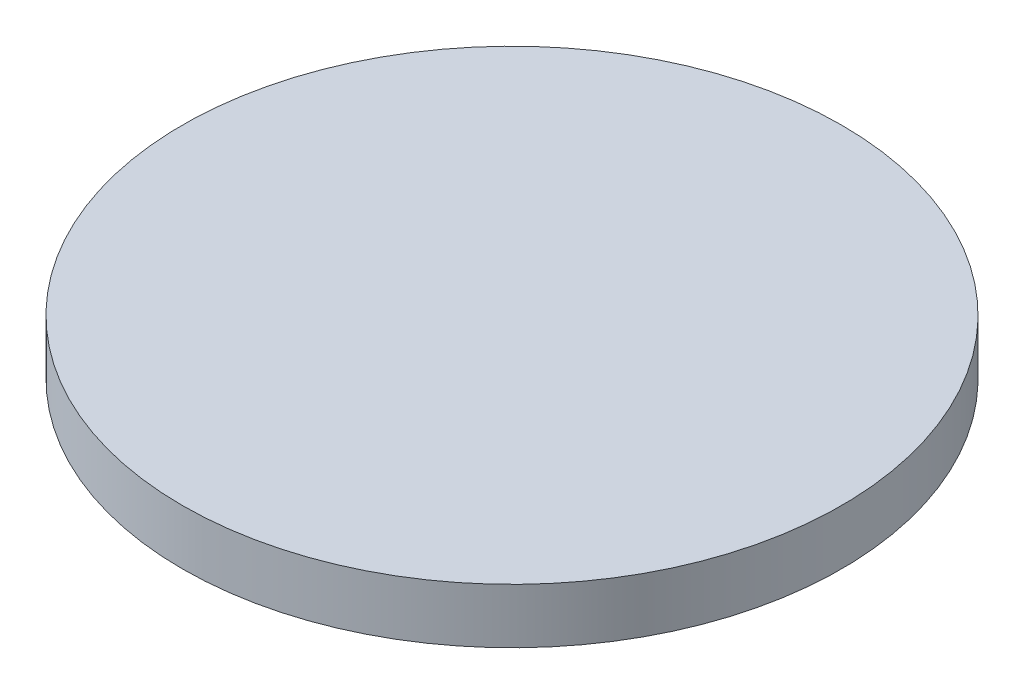
ISO-10303-21;
HEADER;
FILE_DESCRIPTION(('STEP AP214'),'2;1');
FILE_NAME('part.step','',(''),(''),'','','');
FILE_SCHEMA(('AUTOMOTIVE_DESIGN { 1 0 10303 214 1 1 1 1 }'));
ENDSEC;
DATA;
#1=APPLICATION_CONTEXT('core data for automotive mechanical design processes');
#2=APPLICATION_PROTOCOL_DEFINITION('international standard','automotive_design',2000,#1);
#3=PRODUCT_CONTEXT('',#1,'mechanical');
#4=PRODUCT('Part','Part','',(#3));
#5=PRODUCT_RELATED_PRODUCT_CATEGORY('part','',(#4));
#6=PRODUCT_DEFINITION_FORMATION('','',#4);
#7=PRODUCT_DEFINITION_CONTEXT('part definition',#1,'design');
#8=PRODUCT_DEFINITION('design','',#6,#7);
#9=PRODUCT_DEFINITION_SHAPE('','',#8);
#10=(LENGTH_UNIT() NAMED_UNIT(*) SI_UNIT(.MILLI.,.METRE.));
#11=(NAMED_UNIT(*) PLANE_ANGLE_UNIT() SI_UNIT($,.RADIAN.));
#12=(NAMED_UNIT(*) SI_UNIT($,.STERADIAN.) SOLID_ANGLE_UNIT());
#13=UNCERTAINTY_MEASURE_WITH_UNIT(LENGTH_MEASURE(1.E-05),#10,'distance_accuracy_value','');
#14=(GEOMETRIC_REPRESENTATION_CONTEXT(3) GLOBAL_UNCERTAINTY_ASSIGNED_CONTEXT((#13)) GLOBAL_UNIT_ASSIGNED_CONTEXT((#10,
#11,#12)) REPRESENTATION_CONTEXT('',''));
#15=CARTESIAN_POINT('',(0.,0.,0.));
#16=DIRECTION('',(0.,0.,1.));
#17=DIRECTION('',(1.,0.,0.));
#18=AXIS2_PLACEMENT_3D('',#15,#16,#17);
#19=CARTESIAN_POINT('',(0.,2.5,0.));
#20=DIRECTION('',(0.,-1.,0.));
#21=DIRECTION('',(0.,0.,-1.));
#22=AXIS2_PLACEMENT_3D('',#19,#20,#21);
#23=CYLINDRICAL_SURFACE('',#22,15.);
#24=CARTESIAN_POINT('',(0.,2.5,0.));
#25=DIRECTION('',(0.,1.,0.));
#26=DIRECTION('',(0.,0.,1.));
#27=AXIS2_PLACEMENT_3D('',#24,#25,#26);
#28=CIRCLE('',#27,15.);
#29=CARTESIAN_POINT('',(0.,2.5,15.));
#30=VERTEX_POINT('',#29);
#31=EDGE_CURVE('E10',#30,#30,#28,.T.);
#32=ORIENTED_EDGE('',*,*,#31,.F.);
#33=EDGE_LOOP('',(#32));
#34=FACE_BOUND('',#33,.T.);
#35=CARTESIAN_POINT('',(0.,0.,0.));
#36=DIRECTION('',(0.,1.,0.));
#37=DIRECTION('',(0.,0.,1.));
#38=AXIS2_PLACEMENT_3D('',#35,#36,#37);
#39=CIRCLE('',#38,15.);
#40=CARTESIAN_POINT('',(0.,0.,15.));
#41=VERTEX_POINT('',#40);
#42=EDGE_CURVE('E40',#41,#41,#39,.T.);
#43=ORIENTED_EDGE('',*,*,#42,.T.);
#44=EDGE_LOOP('',(#43));
#45=FACE_BOUND('',#44,.T.);
#46=ADVANCED_FACE('F37',(#34,#45),#23,.T.);
#47=CARTESIAN_POINT('',(0.,2.5,0.));
#48=DIRECTION('',(0.,1.,0.));
#49=DIRECTION('',(0.,0.,1.));
#50=AXIS2_PLACEMENT_3D('',#47,#48,#49);
#51=PLANE('',#50);
#52=ORIENTED_EDGE('',*,*,#31,.T.);
#53=EDGE_LOOP('',(#52));
#54=FACE_BOUND('',#53,.T.);
#55=ADVANCED_FACE('F54',(#54),#51,.T.);
#56=CARTESIAN_POINT('',(0.,0.,0.));
#57=DIRECTION('',(0.,1.,0.));
#58=DIRECTION('',(0.,0.,1.));
#59=AXIS2_PLACEMENT_3D('',#56,#57,#58);
#60=PLANE('',#59);
#61=ORIENTED_EDGE('',*,*,#42,.F.);
#62=EDGE_LOOP('',(#61));
#63=FACE_BOUND('',#62,.T.);
#64=ADVANCED_FACE('F52',(#63),#60,.F.);
#65=CLOSED_SHELL('',(#46,#55,#64));
#66=MANIFOLD_SOLID_BREP('B2',#65);
#67=ADVANCED_BREP_SHAPE_REPRESENTATION('',(#18,#66),#14);
#68=SHAPE_DEFINITION_REPRESENTATION(#9,#67);
ENDSEC;
END-ISO-10303-21;
